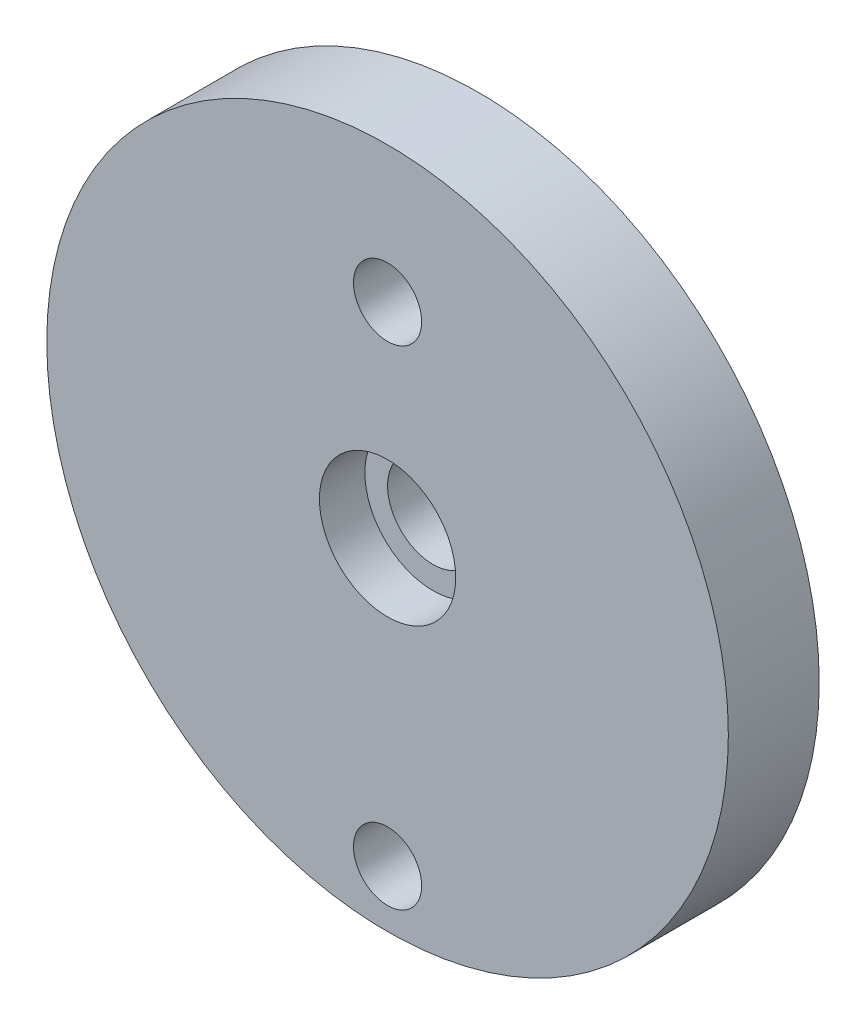
ISO-10303-21;
HEADER;
FILE_DESCRIPTION(('STEP AP214'),'2;1');
FILE_NAME('part.step','',(''),(''),'','','');
FILE_SCHEMA(('AUTOMOTIVE_DESIGN { 1 0 10303 214 1 1 1 1 }'));
ENDSEC;
DATA;
#1=APPLICATION_CONTEXT('core data for automotive mechanical design processes');
#2=APPLICATION_PROTOCOL_DEFINITION('international standard','automotive_design',2000,#1);
#3=PRODUCT_CONTEXT('',#1,'mechanical');
#4=PRODUCT('Part','Part','',(#3));
#5=PRODUCT_RELATED_PRODUCT_CATEGORY('part','',(#4));
#6=PRODUCT_DEFINITION_FORMATION('','',#4);
#7=PRODUCT_DEFINITION_CONTEXT('part definition',#1,'design');
#8=PRODUCT_DEFINITION('design','',#6,#7);
#9=PRODUCT_DEFINITION_SHAPE('','',#8);
#10=(LENGTH_UNIT() NAMED_UNIT(*) SI_UNIT(.MILLI.,.METRE.));
#11=(NAMED_UNIT(*) PLANE_ANGLE_UNIT() SI_UNIT($,.RADIAN.));
#12=(NAMED_UNIT(*) SI_UNIT($,.STERADIAN.) SOLID_ANGLE_UNIT());
#13=UNCERTAINTY_MEASURE_WITH_UNIT(LENGTH_MEASURE(1.E-05),#10,'distance_accuracy_value','');
#14=(GEOMETRIC_REPRESENTATION_CONTEXT(3) GLOBAL_UNCERTAINTY_ASSIGNED_CONTEXT((#13)) GLOBAL_UNIT_ASSIGNED_CONTEXT((#10,
#11,#12)) REPRESENTATION_CONTEXT('',''));
#15=CARTESIAN_POINT('',(0.,0.,0.));
#16=DIRECTION('',(0.,0.,1.));
#17=DIRECTION('',(1.,0.,0.));
#18=AXIS2_PLACEMENT_3D('',#15,#16,#17);
#19=CARTESIAN_POINT('',(0.,-12.5,4.));
#20=DIRECTION('',(0.,0.,-1.));
#21=DIRECTION('',(-1.,0.,0.));
#22=AXIS2_PLACEMENT_3D('',#19,#20,#21);
#23=CYLINDRICAL_SURFACE('',#22,1.5);
#24=CARTESIAN_POINT('',(0.,-12.5,4.));
#25=DIRECTION('',(0.,0.,1.));
#26=DIRECTION('',(1.,0.,0.));
#27=AXIS2_PLACEMENT_3D('',#24,#25,#26);
#28=CIRCLE('',#27,1.5);
#29=CARTESIAN_POINT('',(1.5,-12.5,4.));
#30=VERTEX_POINT('',#29);
#31=EDGE_CURVE('E49',#30,#30,#28,.T.);
#32=ORIENTED_EDGE('',*,*,#31,.T.);
#33=EDGE_LOOP('',(#32));
#34=FACE_BOUND('',#33,.T.);
#35=CARTESIAN_POINT('',(0.,-12.5,0.));
#36=DIRECTION('',(0.,0.,1.));
#37=DIRECTION('',(1.,0.,0.));
#38=AXIS2_PLACEMENT_3D('',#35,#36,#37);
#39=CIRCLE('',#38,1.5);
#40=CARTESIAN_POINT('',(1.5,-12.5,0.));
#41=VERTEX_POINT('',#40);
#42=EDGE_CURVE('E61',#41,#41,#39,.T.);
#43=ORIENTED_EDGE('',*,*,#42,.F.);
#44=EDGE_LOOP('',(#43));
#45=FACE_BOUND('',#44,.T.);
#46=ADVANCED_FACE('F38',(#34,#45),#23,.F.);
#47=CARTESIAN_POINT('',(0.,0.,4.));
#48=DIRECTION('',(0.,0.,-1.));
#49=DIRECTION('',(-1.,0.,0.));
#50=AXIS2_PLACEMENT_3D('',#47,#48,#49);
#51=CYLINDRICAL_SURFACE('',#50,3.);
#52=CARTESIAN_POINT('',(0.,0.,2.));
#53=DIRECTION('',(0.,0.,1.));
#54=DIRECTION('',(1.,0.,0.));
#55=AXIS2_PLACEMENT_3D('',#52,#53,#54);
#56=CIRCLE('',#55,3.);
#57=CARTESIAN_POINT('',(3.,0.,2.));
#58=VERTEX_POINT('',#57);
#59=EDGE_CURVE('E10',#58,#58,#56,.T.);
#60=ORIENTED_EDGE('',*,*,#59,.F.);
#61=EDGE_LOOP('',(#60));
#62=FACE_BOUND('',#61,.T.);
#63=CARTESIAN_POINT('',(0.,0.,4.));
#64=DIRECTION('',(0.,0.,1.));
#65=DIRECTION('',(1.,0.,0.));
#66=AXIS2_PLACEMENT_3D('',#63,#64,#65);
#67=CIRCLE('',#66,3.);
#68=CARTESIAN_POINT('',(3.,0.,4.));
#69=VERTEX_POINT('',#68);
#70=EDGE_CURVE('E54',#69,#69,#67,.T.);
#71=ORIENTED_EDGE('',*,*,#70,.T.);
#72=EDGE_LOOP('',(#71));
#73=FACE_BOUND('',#72,.T.);
#74=ADVANCED_FACE('F93',(#62,#73),#51,.F.);
#75=CARTESIAN_POINT('',(0.,0.,4.));
#76=DIRECTION('',(0.,0.,-1.));
#77=DIRECTION('',(-1.,0.,0.));
#78=AXIS2_PLACEMENT_3D('',#75,#76,#77);
#79=CYLINDRICAL_SURFACE('',#78,15.);
#80=CARTESIAN_POINT('',(0.,0.,4.));
#81=DIRECTION('',(0.,0.,1.));
#82=DIRECTION('',(1.,0.,0.));
#83=AXIS2_PLACEMENT_3D('',#80,#81,#82);
#84=CIRCLE('',#83,15.);
#85=CARTESIAN_POINT('',(15.,0.,4.));
#86=VERTEX_POINT('',#85);
#87=EDGE_CURVE('E66',#86,#86,#84,.T.);
#88=ORIENTED_EDGE('',*,*,#87,.F.);
#89=EDGE_LOOP('',(#88));
#90=FACE_BOUND('',#89,.T.);
#91=CARTESIAN_POINT('',(0.,0.,0.));
#92=DIRECTION('',(0.,0.,1.));
#93=DIRECTION('',(1.,0.,0.));
#94=AXIS2_PLACEMENT_3D('',#91,#92,#93);
#95=CIRCLE('',#94,15.);
#96=CARTESIAN_POINT('',(15.,0.,0.));
#97=VERTEX_POINT('',#96);
#98=EDGE_CURVE('E58',#97,#97,#95,.T.);
#99=ORIENTED_EDGE('',*,*,#98,.T.);
#100=EDGE_LOOP('',(#99));
#101=FACE_BOUND('',#100,.T.);
#102=ADVANCED_FACE('F40',(#90,#101),#79,.T.);
#103=CARTESIAN_POINT('',(0.,9.,4.));
#104=DIRECTION('',(0.,0.,-1.));
#105=DIRECTION('',(-1.,0.,0.));
#106=AXIS2_PLACEMENT_3D('',#103,#104,#105);
#107=CYLINDRICAL_SURFACE('',#106,1.5);
#108=CARTESIAN_POINT('',(0.,9.,4.));
#109=DIRECTION('',(0.,0.,1.));
#110=DIRECTION('',(1.,0.,0.));
#111=AXIS2_PLACEMENT_3D('',#108,#109,#110);
#112=CIRCLE('',#111,1.5);
#113=CARTESIAN_POINT('',(1.5,9.,4.));
#114=VERTEX_POINT('',#113);
#115=EDGE_CURVE('E45',#114,#114,#112,.F.);
#116=ORIENTED_EDGE('',*,*,#115,.F.);
#117=EDGE_LOOP('',(#116));
#118=FACE_BOUND('',#117,.T.);
#119=CARTESIAN_POINT('',(0.,9.,0.));
#120=DIRECTION('',(0.,0.,1.));
#121=DIRECTION('',(1.,0.,0.));
#122=AXIS2_PLACEMENT_3D('',#119,#120,#121);
#123=CIRCLE('',#122,1.5);
#124=CARTESIAN_POINT('',(1.5,9.,0.));
#125=VERTEX_POINT('',#124);
#126=EDGE_CURVE('E64',#125,#125,#123,.F.);
#127=ORIENTED_EDGE('',*,*,#126,.T.);
#128=EDGE_LOOP('',(#127));
#129=FACE_BOUND('',#128,.T.);
#130=ADVANCED_FACE('F102',(#118,#129),#107,.F.);
#131=CARTESIAN_POINT('',(0.,0.,4.));
#132=DIRECTION('',(0.,0.,1.));
#133=DIRECTION('',(1.,0.,0.));
#134=AXIS2_PLACEMENT_3D('',#131,#132,#133);
#135=PLANE('',#134);
#136=ORIENTED_EDGE('',*,*,#87,.T.);
#137=EDGE_LOOP('',(#136));
#138=FACE_BOUND('',#137,.T.);
#139=ORIENTED_EDGE('',*,*,#70,.F.);
#140=EDGE_LOOP('',(#139));
#141=FACE_BOUND('',#140,.T.);
#142=ORIENTED_EDGE('',*,*,#31,.F.);
#143=EDGE_LOOP('',(#142));
#144=FACE_BOUND('',#143,.T.);
#145=ORIENTED_EDGE('',*,*,#115,.T.);
#146=EDGE_LOOP('',(#145));
#147=FACE_BOUND('',#146,.T.);
#148=ADVANCED_FACE('F105',(#138,#141,#144,#147),#135,.T.);
#149=CARTESIAN_POINT('',(0.,0.,0.));
#150=DIRECTION('',(0.,0.,1.));
#151=DIRECTION('',(1.,0.,0.));
#152=AXIS2_PLACEMENT_3D('',#149,#150,#151);
#153=PLANE('',#152);
#154=ORIENTED_EDGE('',*,*,#98,.F.);
#155=EDGE_LOOP('',(#154));
#156=FACE_BOUND('',#155,.T.);
#157=ORIENTED_EDGE('',*,*,#42,.T.);
#158=EDGE_LOOP('',(#157));
#159=FACE_BOUND('',#158,.T.);
#160=ORIENTED_EDGE('',*,*,#126,.F.);
#161=EDGE_LOOP('',(#160));
#162=FACE_BOUND('',#161,.T.);
#163=CARTESIAN_POINT('',(0.,0.,0.));
#164=DIRECTION('',(0.,0.,1.));
#165=DIRECTION('',(1.,0.,0.));
#166=AXIS2_PLACEMENT_3D('',#163,#164,#165);
#167=CIRCLE('',#166,2.);
#168=CARTESIAN_POINT('',(2.,0.,0.));
#169=VERTEX_POINT('',#168);
#170=EDGE_CURVE('E75',#169,#169,#167,.T.);
#171=ORIENTED_EDGE('',*,*,#170,.T.);
#172=EDGE_LOOP('',(#171));
#173=FACE_BOUND('',#172,.T.);
#174=ADVANCED_FACE('F90',(#156,#159,#162,#173),#153,.F.);
#175=CARTESIAN_POINT('',(0.,0.,2.));
#176=DIRECTION('',(0.,0.,-1.));
#177=DIRECTION('',(-1.,0.,0.));
#178=AXIS2_PLACEMENT_3D('',#175,#176,#177);
#179=CYLINDRICAL_SURFACE('',#178,2.);
#180=CARTESIAN_POINT('',(0.,0.,2.));
#181=DIRECTION('',(0.,0.,1.));
#182=DIRECTION('',(1.,0.,0.));
#183=AXIS2_PLACEMENT_3D('',#180,#181,#182);
#184=CIRCLE('',#183,2.);
#185=CARTESIAN_POINT('',(2.,0.,2.));
#186=VERTEX_POINT('',#185);
#187=EDGE_CURVE('E62',#186,#186,#184,.T.);
#188=ORIENTED_EDGE('',*,*,#187,.T.);
#189=EDGE_LOOP('',(#188));
#190=FACE_BOUND('',#189,.T.);
#191=ORIENTED_EDGE('',*,*,#170,.F.);
#192=EDGE_LOOP('',(#191));
#193=FACE_BOUND('',#192,.T.);
#194=ADVANCED_FACE('F81',(#190,#193),#179,.F.);
#195=CARTESIAN_POINT('',(0.,0.,2.));
#196=DIRECTION('',(0.,0.,1.));
#197=DIRECTION('',(1.,0.,0.));
#198=AXIS2_PLACEMENT_3D('',#195,#196,#197);
#199=PLANE('',#198);
#200=ORIENTED_EDGE('',*,*,#187,.F.);
#201=EDGE_LOOP('',(#200));
#202=FACE_BOUND('',#201,.T.);
#203=ORIENTED_EDGE('',*,*,#59,.T.);
#204=EDGE_LOOP('',(#203));
#205=FACE_BOUND('',#204,.T.);
#206=ADVANCED_FACE('F84',(#202,#205),#199,.T.);
#207=CLOSED_SHELL('',(#46,#74,#102,#130,#148,#174,#194,#206));
#208=MANIFOLD_SOLID_BREP('B2',#207);
#209=ADVANCED_BREP_SHAPE_REPRESENTATION('',(#18,#208),#14);
#210=SHAPE_DEFINITION_REPRESENTATION(#9,#209);
ENDSEC;
END-ISO-10303-21;
